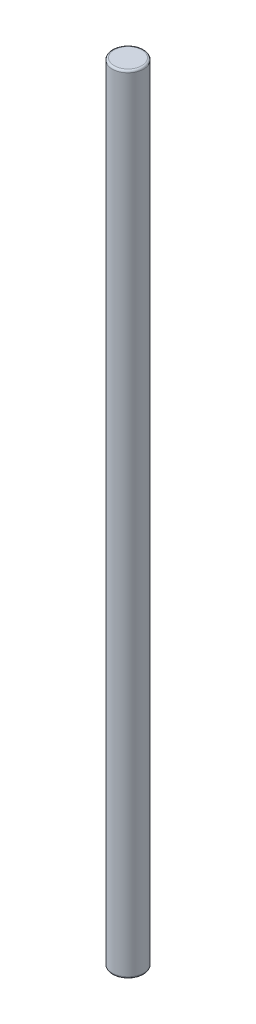
ISO-10303-21;
HEADER;
FILE_DESCRIPTION(('STEP AP214'),'2;1');
FILE_NAME('part.step','',(''),(''),'','','');
FILE_SCHEMA(('AUTOMOTIVE_DESIGN { 1 0 10303 214 1 1 1 1 }'));
ENDSEC;
DATA;
#1=APPLICATION_CONTEXT('core data for automotive mechanical design processes');
#2=APPLICATION_PROTOCOL_DEFINITION('international standard','automotive_design',2000,#1);
#3=PRODUCT_CONTEXT('',#1,'mechanical');
#4=PRODUCT('Part','Part','',(#3));
#5=PRODUCT_RELATED_PRODUCT_CATEGORY('part','',(#4));
#6=PRODUCT_DEFINITION_FORMATION('','',#4);
#7=PRODUCT_DEFINITION_CONTEXT('part definition',#1,'design');
#8=PRODUCT_DEFINITION('design','',#6,#7);
#9=PRODUCT_DEFINITION_SHAPE('','',#8);
#10=(LENGTH_UNIT() NAMED_UNIT(*) SI_UNIT(.MILLI.,.METRE.));
#11=(NAMED_UNIT(*) PLANE_ANGLE_UNIT() SI_UNIT($,.RADIAN.));
#12=(NAMED_UNIT(*) SI_UNIT($,.STERADIAN.) SOLID_ANGLE_UNIT());
#13=UNCERTAINTY_MEASURE_WITH_UNIT(LENGTH_MEASURE(1.E-05),#10,'distance_accuracy_value','');
#14=(GEOMETRIC_REPRESENTATION_CONTEXT(3) GLOBAL_UNCERTAINTY_ASSIGNED_CONTEXT((#13)) GLOBAL_UNIT_ASSIGNED_CONTEXT((#10,
#11,#12)) REPRESENTATION_CONTEXT('',''));
#15=CARTESIAN_POINT('',(0.,0.,0.));
#16=DIRECTION('',(0.,0.,1.));
#17=DIRECTION('',(1.,0.,0.));
#18=AXIS2_PLACEMENT_3D('',#15,#16,#17);
#19=CARTESIAN_POINT('',(0.,100.,0.));
#20=DIRECTION('',(0.,-1.,0.));
#21=DIRECTION('',(0.,0.,-1.));
#22=AXIS2_PLACEMENT_3D('',#19,#20,#21);
#23=CYLINDRICAL_SURFACE('',#22,2.);
#24=CARTESIAN_POINT('',(0.,0.25,0.));
#25=DIRECTION('',(0.,1.,0.));
#26=DIRECTION('',(0.,0.,1.));
#27=AXIS2_PLACEMENT_3D('',#24,#25,#26);
#28=CIRCLE('',#27,2.);
#29=CARTESIAN_POINT('',(0.,0.25,2.));
#30=VERTEX_POINT('',#29);
#31=EDGE_CURVE('E42',#30,#30,#28,.T.);
#32=ORIENTED_EDGE('',*,*,#31,.T.);
#33=EDGE_LOOP('',(#32));
#34=FACE_BOUND('',#33,.T.);
#35=CARTESIAN_POINT('',(0.,99.75,0.));
#36=DIRECTION('',(0.,1.,0.));
#37=DIRECTION('',(0.,0.,1.));
#38=AXIS2_PLACEMENT_3D('',#35,#36,#37);
#39=CIRCLE('',#38,2.);
#40=CARTESIAN_POINT('',(0.,99.75,2.));
#41=VERTEX_POINT('',#40);
#42=EDGE_CURVE('E46',#41,#41,#39,.F.);
#43=ORIENTED_EDGE('',*,*,#42,.T.);
#44=EDGE_LOOP('',(#43));
#45=FACE_BOUND('',#44,.T.);
#46=ADVANCED_FACE('F31',(#34,#45),#23,.T.);
#47=CARTESIAN_POINT('',(0.,100.,0.));
#48=DIRECTION('',(0.,1.,0.));
#49=DIRECTION('',(0.,0.,1.));
#50=AXIS2_PLACEMENT_3D('',#47,#48,#49);
#51=PLANE('',#50);
#52=CARTESIAN_POINT('',(0.,100.,0.));
#53=DIRECTION('',(0.,1.,0.));
#54=DIRECTION('',(0.,0.,1.));
#55=AXIS2_PLACEMENT_3D('',#52,#53,#54);
#56=CIRCLE('',#55,1.75);
#57=CARTESIAN_POINT('',(0.,100.,1.75));
#58=VERTEX_POINT('',#57);
#59=EDGE_CURVE('E10',#58,#58,#56,.T.);
#60=ORIENTED_EDGE('',*,*,#59,.T.);
#61=EDGE_LOOP('',(#60));
#62=FACE_BOUND('',#61,.T.);
#63=ADVANCED_FACE('F62',(#62),#51,.T.);
#64=CARTESIAN_POINT('',(0.,0.,0.));
#65=DIRECTION('',(0.,1.,0.));
#66=DIRECTION('',(0.,0.,1.));
#67=AXIS2_PLACEMENT_3D('',#64,#65,#66);
#68=PLANE('',#67);
#69=CARTESIAN_POINT('',(0.,0.,0.));
#70=DIRECTION('',(0.,1.,0.));
#71=DIRECTION('',(0.,0.,1.));
#72=AXIS2_PLACEMENT_3D('',#69,#70,#71);
#73=CIRCLE('',#72,1.75);
#74=CARTESIAN_POINT('',(0.,0.,1.75));
#75=VERTEX_POINT('',#74);
#76=EDGE_CURVE('E38',#75,#75,#73,.F.);
#77=ORIENTED_EDGE('',*,*,#76,.T.);
#78=EDGE_LOOP('',(#77));
#79=FACE_BOUND('',#78,.T.);
#80=ADVANCED_FACE('F59',(#79),#68,.F.);
#81=CARTESIAN_POINT('',(0.,0.25,0.));
#82=DIRECTION('',(0.,1.,0.));
#83=DIRECTION('',(0.,0.,1.));
#84=AXIS2_PLACEMENT_3D('',#81,#82,#83);
#85=TOROIDAL_SURFACE('',#84,1.75,0.25);
#86=ORIENTED_EDGE('',*,*,#76,.F.);
#87=EDGE_LOOP('',(#86));
#88=FACE_BOUND('',#87,.T.);
#89=ORIENTED_EDGE('',*,*,#31,.F.);
#90=EDGE_LOOP('',(#89));
#91=FACE_BOUND('',#90,.T.);
#92=ADVANCED_FACE('F55',(#88,#91),#85,.T.);
#93=CARTESIAN_POINT('',(0.,99.75,0.));
#94=DIRECTION('',(0.,1.,0.));
#95=DIRECTION('',(0.,0.,1.));
#96=AXIS2_PLACEMENT_3D('',#93,#94,#95);
#97=TOROIDAL_SURFACE('',#96,1.75,0.25);
#98=ORIENTED_EDGE('',*,*,#42,.F.);
#99=EDGE_LOOP('',(#98));
#100=FACE_BOUND('',#99,.T.);
#101=ORIENTED_EDGE('',*,*,#59,.F.);
#102=EDGE_LOOP('',(#101));
#103=FACE_BOUND('',#102,.T.);
#104=ADVANCED_FACE('F33',(#100,#103),#97,.T.);
#105=CLOSED_SHELL('',(#46,#63,#80,#92,#104));
#106=MANIFOLD_SOLID_BREP('B2',#105);
#107=ADVANCED_BREP_SHAPE_REPRESENTATION('',(#18,#106),#14);
#108=SHAPE_DEFINITION_REPRESENTATION(#9,#107);
ENDSEC;
END-ISO-10303-21;
